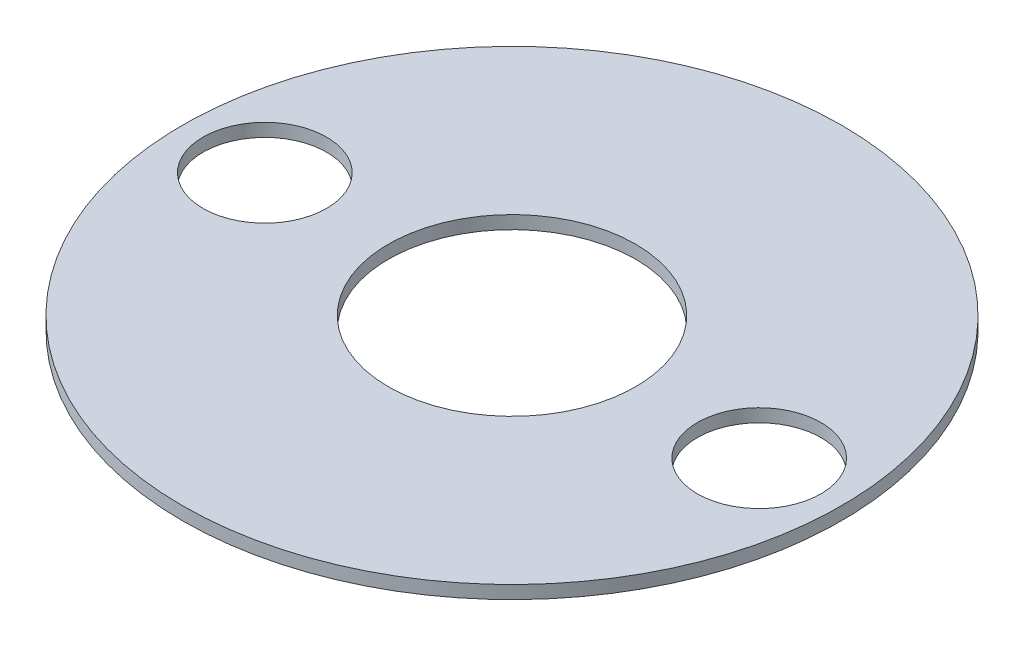
ISO-10303-21;
HEADER;
FILE_DESCRIPTION(('STEP AP214'),'2;1');
FILE_NAME('part.step','',(''),(''),'','','');
FILE_SCHEMA(('AUTOMOTIVE_DESIGN { 1 0 10303 214 1 1 1 1 }'));
ENDSEC;
DATA;
#1=APPLICATION_CONTEXT('core data for automotive mechanical design processes');
#2=APPLICATION_PROTOCOL_DEFINITION('international standard','automotive_design',2000,#1);
#3=PRODUCT_CONTEXT('',#1,'mechanical');
#4=PRODUCT('Part','Part','',(#3));
#5=PRODUCT_RELATED_PRODUCT_CATEGORY('part','',(#4));
#6=PRODUCT_DEFINITION_FORMATION('','',#4);
#7=PRODUCT_DEFINITION_CONTEXT('part definition',#1,'design');
#8=PRODUCT_DEFINITION('design','',#6,#7);
#9=PRODUCT_DEFINITION_SHAPE('','',#8);
#10=(LENGTH_UNIT() NAMED_UNIT(*) SI_UNIT(.MILLI.,.METRE.));
#11=(NAMED_UNIT(*) PLANE_ANGLE_UNIT() SI_UNIT($,.RADIAN.));
#12=(NAMED_UNIT(*) SI_UNIT($,.STERADIAN.) SOLID_ANGLE_UNIT());
#13=UNCERTAINTY_MEASURE_WITH_UNIT(LENGTH_MEASURE(1.E-05),#10,'distance_accuracy_value','');
#14=(GEOMETRIC_REPRESENTATION_CONTEXT(3) GLOBAL_UNCERTAINTY_ASSIGNED_CONTEXT((#13)) GLOBAL_UNIT_ASSIGNED_CONTEXT((#10,
#11,#12)) REPRESENTATION_CONTEXT('',''));
#15=CARTESIAN_POINT('',(0.,0.,0.));
#16=DIRECTION('',(0.,0.,1.));
#17=DIRECTION('',(1.,0.,0.));
#18=AXIS2_PLACEMENT_3D('',#15,#16,#17);
#19=CARTESIAN_POINT('',(0.,0.3175,0.));
#20=DIRECTION('',(0.,1.,0.));
#21=DIRECTION('',(0.,0.,1.));
#22=AXIS2_PLACEMENT_3D('',#19,#20,#21);
#23=PLANE('',#22);
#24=CARTESIAN_POINT('',(0.,0.3175,0.));
#25=DIRECTION('',(0.,1.,0.));
#26=DIRECTION('',(0.,0.,1.));
#27=AXIS2_PLACEMENT_3D('',#24,#25,#26);
#28=CIRCLE('',#27,3.);
#29=CARTESIAN_POINT('',(0.,0.3175,3.));
#30=VERTEX_POINT('',#29);
#31=EDGE_CURVE('E58',#30,#30,#28,.T.);
#32=ORIENTED_EDGE('',*,*,#31,.F.);
#33=EDGE_LOOP('',(#32));
#34=FACE_BOUND('',#33,.T.);
#35=CARTESIAN_POINT('',(-6.,0.3175,0.));
#36=DIRECTION('',(0.,1.,0.));
#37=DIRECTION('',(0.,0.,1.));
#38=AXIS2_PLACEMENT_3D('',#35,#36,#37);
#39=CIRCLE('',#38,1.5);
#40=CARTESIAN_POINT('',(-6.,0.3175,1.5));
#41=VERTEX_POINT('',#40);
#42=EDGE_CURVE('E52',#41,#41,#39,.T.);
#43=ORIENTED_EDGE('',*,*,#42,.F.);
#44=EDGE_LOOP('',(#43));
#45=FACE_BOUND('',#44,.T.);
#46=CARTESIAN_POINT('',(6.,0.3175,0.));
#47=DIRECTION('',(0.,1.,0.));
#48=DIRECTION('',(0.,0.,1.));
#49=AXIS2_PLACEMENT_3D('',#46,#47,#48);
#50=CIRCLE('',#49,1.5);
#51=CARTESIAN_POINT('',(6.,0.3175,1.5));
#52=VERTEX_POINT('',#51);
#53=EDGE_CURVE('E46',#52,#52,#50,.T.);
#54=ORIENTED_EDGE('',*,*,#53,.F.);
#55=EDGE_LOOP('',(#54));
#56=FACE_BOUND('',#55,.T.);
#57=CARTESIAN_POINT('',(0.,0.3175,0.));
#58=DIRECTION('',(0.,1.,0.));
#59=DIRECTION('',(0.,0.,1.));
#60=AXIS2_PLACEMENT_3D('',#57,#58,#59);
#61=CIRCLE('',#60,8.);
#62=CARTESIAN_POINT('',(0.,0.3175,8.));
#63=VERTEX_POINT('',#62);
#64=EDGE_CURVE('E37',#63,#63,#61,.T.);
#65=ORIENTED_EDGE('',*,*,#64,.T.);
#66=EDGE_LOOP('',(#65));
#67=FACE_BOUND('',#66,.T.);
#68=ADVANCED_FACE('F33',(#34,#45,#56,#67),#23,.T.);
#69=CARTESIAN_POINT('',(0.,0.,0.));
#70=DIRECTION('',(0.,1.,0.));
#71=DIRECTION('',(0.,0.,1.));
#72=AXIS2_PLACEMENT_3D('',#69,#70,#71);
#73=CYLINDRICAL_SURFACE('',#72,8.);
#74=CARTESIAN_POINT('',(0.,0.,0.));
#75=DIRECTION('',(0.,1.,0.));
#76=DIRECTION('',(0.,0.,1.));
#77=AXIS2_PLACEMENT_3D('',#74,#75,#76);
#78=CIRCLE('',#77,8.);
#79=CARTESIAN_POINT('',(0.,0.,8.));
#80=VERTEX_POINT('',#79);
#81=EDGE_CURVE('E10',#80,#80,#78,.T.);
#82=ORIENTED_EDGE('',*,*,#81,.T.);
#83=EDGE_LOOP('',(#82));
#84=FACE_BOUND('',#83,.T.);
#85=ORIENTED_EDGE('',*,*,#64,.F.);
#86=EDGE_LOOP('',(#85));
#87=FACE_BOUND('',#86,.T.);
#88=ADVANCED_FACE('F75',(#84,#87),#73,.T.);
#89=CARTESIAN_POINT('',(0.,0.,0.));
#90=DIRECTION('',(0.,1.,0.));
#91=DIRECTION('',(0.,0.,1.));
#92=AXIS2_PLACEMENT_3D('',#89,#90,#91);
#93=PLANE('',#92);
#94=CARTESIAN_POINT('',(0.,0.,0.));
#95=DIRECTION('',(0.,1.,0.));
#96=DIRECTION('',(0.,0.,1.));
#97=AXIS2_PLACEMENT_3D('',#94,#95,#96);
#98=CIRCLE('',#97,3.);
#99=CARTESIAN_POINT('',(0.,0.,3.));
#100=VERTEX_POINT('',#99);
#101=EDGE_CURVE('E55',#100,#100,#98,.T.);
#102=ORIENTED_EDGE('',*,*,#101,.T.);
#103=EDGE_LOOP('',(#102));
#104=FACE_BOUND('',#103,.T.);
#105=CARTESIAN_POINT('',(-6.,0.,0.));
#106=DIRECTION('',(0.,1.,0.));
#107=DIRECTION('',(0.,0.,1.));
#108=AXIS2_PLACEMENT_3D('',#105,#106,#107);
#109=CIRCLE('',#108,1.5);
#110=CARTESIAN_POINT('',(-6.,0.,1.5));
#111=VERTEX_POINT('',#110);
#112=EDGE_CURVE('E49',#111,#111,#109,.T.);
#113=ORIENTED_EDGE('',*,*,#112,.T.);
#114=EDGE_LOOP('',(#113));
#115=FACE_BOUND('',#114,.T.);
#116=CARTESIAN_POINT('',(6.,0.,0.));
#117=DIRECTION('',(0.,1.,0.));
#118=DIRECTION('',(0.,0.,1.));
#119=AXIS2_PLACEMENT_3D('',#116,#117,#118);
#120=CIRCLE('',#119,1.5);
#121=CARTESIAN_POINT('',(6.,0.,1.5));
#122=VERTEX_POINT('',#121);
#123=EDGE_CURVE('E44',#122,#122,#120,.T.);
#124=ORIENTED_EDGE('',*,*,#123,.T.);
#125=EDGE_LOOP('',(#124));
#126=FACE_BOUND('',#125,.T.);
#127=ORIENTED_EDGE('',*,*,#81,.F.);
#128=EDGE_LOOP('',(#127));
#129=FACE_BOUND('',#128,.T.);
#130=ADVANCED_FACE('F35',(#104,#115,#126,#129),#93,.F.);
#131=CARTESIAN_POINT('',(6.,0.,0.));
#132=DIRECTION('',(0.,1.,0.));
#133=DIRECTION('',(0.,0.,1.));
#134=AXIS2_PLACEMENT_3D('',#131,#132,#133);
#135=CYLINDRICAL_SURFACE('',#134,1.5);
#136=ORIENTED_EDGE('',*,*,#123,.F.);
#137=EDGE_LOOP('',(#136));
#138=FACE_BOUND('',#137,.T.);
#139=ORIENTED_EDGE('',*,*,#53,.T.);
#140=EDGE_LOOP('',(#139));
#141=FACE_BOUND('',#140,.T.);
#142=ADVANCED_FACE('F87',(#138,#141),#135,.F.);
#143=CARTESIAN_POINT('',(-6.,0.,0.));
#144=DIRECTION('',(0.,1.,0.));
#145=DIRECTION('',(0.,0.,1.));
#146=AXIS2_PLACEMENT_3D('',#143,#144,#145);
#147=CYLINDRICAL_SURFACE('',#146,1.5);
#148=ORIENTED_EDGE('',*,*,#112,.F.);
#149=EDGE_LOOP('',(#148));
#150=FACE_BOUND('',#149,.T.);
#151=ORIENTED_EDGE('',*,*,#42,.T.);
#152=EDGE_LOOP('',(#151));
#153=FACE_BOUND('',#152,.T.);
#154=ADVANCED_FACE('F69',(#150,#153),#147,.F.);
#155=CARTESIAN_POINT('',(0.,0.,0.));
#156=DIRECTION('',(0.,1.,0.));
#157=DIRECTION('',(0.,0.,1.));
#158=AXIS2_PLACEMENT_3D('',#155,#156,#157);
#159=CYLINDRICAL_SURFACE('',#158,3.);
#160=ORIENTED_EDGE('',*,*,#101,.F.);
#161=EDGE_LOOP('',(#160));
#162=FACE_BOUND('',#161,.T.);
#163=ORIENTED_EDGE('',*,*,#31,.T.);
#164=EDGE_LOOP('',(#163));
#165=FACE_BOUND('',#164,.T.);
#166=ADVANCED_FACE('F66',(#162,#165),#159,.F.);
#167=CLOSED_SHELL('',(#68,#88,#130,#142,#154,#166));
#168=MANIFOLD_SOLID_BREP('B2',#167);
#169=ADVANCED_BREP_SHAPE_REPRESENTATION('',(#18,#168),#14);
#170=SHAPE_DEFINITION_REPRESENTATION(#9,#169);
ENDSEC;
END-ISO-10303-21;
